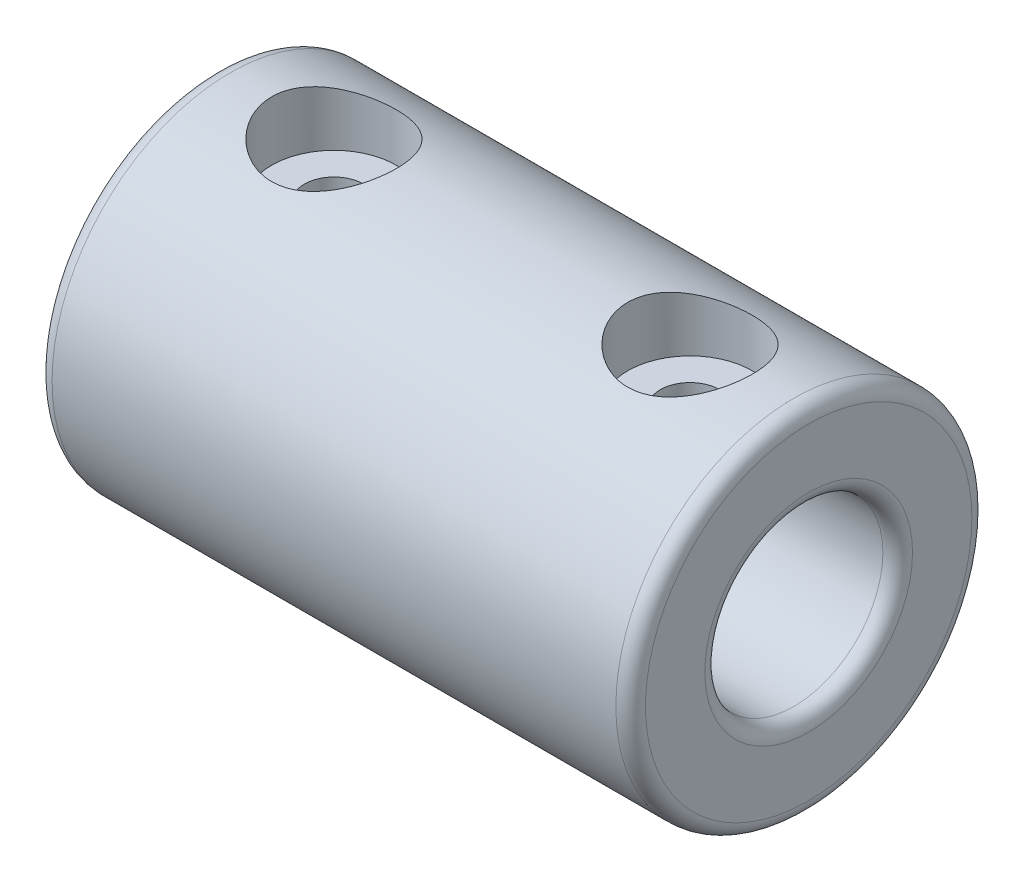
ISO-10303-21;
HEADER;
FILE_DESCRIPTION(('STEP AP214'),'2;1');
FILE_NAME('part.step','',(''),(''),'','','');
FILE_SCHEMA(('AUTOMOTIVE_DESIGN { 1 0 10303 214 1 1 1 1 }'));
ENDSEC;
DATA;
#1=APPLICATION_CONTEXT('core data for automotive mechanical design processes');
#2=APPLICATION_PROTOCOL_DEFINITION('international standard','automotive_design',2000,#1);
#3=PRODUCT_CONTEXT('',#1,'mechanical');
#4=PRODUCT('Part','Part','',(#3));
#5=PRODUCT_RELATED_PRODUCT_CATEGORY('part','',(#4));
#6=PRODUCT_DEFINITION_FORMATION('','',#4);
#7=PRODUCT_DEFINITION_CONTEXT('part definition',#1,'design');
#8=PRODUCT_DEFINITION('design','',#6,#7);
#9=PRODUCT_DEFINITION_SHAPE('','',#8);
#10=(LENGTH_UNIT() NAMED_UNIT(*) SI_UNIT(.MILLI.,.METRE.));
#11=(NAMED_UNIT(*) PLANE_ANGLE_UNIT() SI_UNIT($,.RADIAN.));
#12=(NAMED_UNIT(*) SI_UNIT($,.STERADIAN.) SOLID_ANGLE_UNIT());
#13=UNCERTAINTY_MEASURE_WITH_UNIT(LENGTH_MEASURE(1.E-05),#10,'distance_accuracy_value','');
#14=(GEOMETRIC_REPRESENTATION_CONTEXT(3) GLOBAL_UNCERTAINTY_ASSIGNED_CONTEXT((#13)) GLOBAL_UNIT_ASSIGNED_CONTEXT((#10,
#11,#12)) REPRESENTATION_CONTEXT('',''));
#15=CARTESIAN_POINT('',(0.,0.,0.));
#16=DIRECTION('',(0.,0.,1.));
#17=DIRECTION('',(1.,0.,0.));
#18=AXIS2_PLACEMENT_3D('',#15,#16,#17);
#19=CARTESIAN_POINT('',(-6.,6.001,0.));
#20=DIRECTION('',(0.,-1.,0.));
#21=DIRECTION('',(0.,0.,-1.));
#22=AXIS2_PLACEMENT_3D('',#19,#20,#21);
#23=CYLINDRICAL_SURFACE('',#22,1.);
#24=CARTESIAN_POINT('',(-6.,1.73205080756888,-1.));
#25=CARTESIAN_POINT('',(-6.05210780819525,1.73205534728459,-0.999996363074531));
#26=CARTESIAN_POINT('',(-6.10428141152505,1.73443801187756,-0.995899970733216));
#27=CARTESIAN_POINT('',(-6.20702726467716,1.74362366452052,-0.979723209898053));
#28=CARTESIAN_POINT('',(-6.25759591504341,1.75043594055559,-0.967626064554179));
#29=CARTESIAN_POINT('',(-6.35545166434394,1.76749346605398,-0.936099948699812));
#30=CARTESIAN_POINT('',(-6.40275465247359,1.77772043473252,-0.916709952493731));
#31=CARTESIAN_POINT('',(-6.49342420199672,1.80042664816858,-0.871267525376372));
#32=CARTESIAN_POINT('',(-6.53679055026246,1.81290601476065,-0.845214734035773));
#33=CARTESIAN_POINT('',(-6.62230572855751,1.83996869057441,-0.784666540530879));
#34=CARTESIAN_POINT('',(-6.66405913567355,1.85464063637954,-0.74965203614377));
#35=CARTESIAN_POINT('',(-6.74140838840671,1.88371982785706,-0.673253807614468));
#36=CARTESIAN_POINT('',(-6.77700116258352,1.8981269383125,-0.631866925782293));
#37=CARTESIAN_POINT('',(-6.84336715114767,1.92621476952949,-0.540489563414546));
#38=CARTESIAN_POINT('',(-6.87365376785953,1.93978106418172,-0.490107189012575));
#39=CARTESIAN_POINT('',(-6.92514085324577,1.96350756099529,-0.384157026599504));
#40=CARTESIAN_POINT('',(-6.94634705613717,1.97366991183742,-0.328592538138155));
#41=CARTESIAN_POINT('',(-6.9775046613011,1.98880461244237,-0.218044943925977));
#42=CARTESIAN_POINT('',(-6.98814952635554,1.99409480220892,-0.163301790488817));
#43=CARTESIAN_POINT('',(-7.00016611867504,2.00007583846067,-0.0525706286978481));
#44=CARTESIAN_POINT('',(-7.00154345679571,2.0007694678459,0.00341660584373854));
#45=CARTESIAN_POINT('',(-6.99525332602965,1.9976298191645,0.10983252442375));
#46=CARTESIAN_POINT('',(-6.98836198447878,1.9941849589216,0.160321199176791));
#47=CARTESIAN_POINT('',(-6.96711915609535,1.98374245259747,0.259313771918322));
#48=CARTESIAN_POINT('',(-6.95276711102378,1.97674454066394,0.307817521093925));
#49=CARTESIAN_POINT('',(-6.91691743391019,1.95971583287654,0.402309391569553));
#50=CARTESIAN_POINT('',(-6.89532368682794,1.94964441529199,0.448253423515178));
#51=CARTESIAN_POINT('',(-6.84573658379851,1.92737645986687,0.535976801513328));
#52=CARTESIAN_POINT('',(-6.81774093669765,1.91517916157484,0.577754648838646));
#53=CARTESIAN_POINT('',(-6.75310464846699,1.88844394399229,0.660173660898195));
#54=CARTESIAN_POINT('',(-6.71589697167399,1.87379375998175,0.70033407502936));
#55=CARTESIAN_POINT('',(-6.63541027506983,1.84454340586812,0.77410437029778));
#56=CARTESIAN_POINT('',(-6.59212662772594,1.82994328265629,0.807709211574231));
#57=CARTESIAN_POINT('',(-6.49735180757592,1.80144156092485,0.869505334642211));
#58=CARTESIAN_POINT('',(-6.44551397694579,1.78764319990708,0.897217314978051));
#59=CARTESIAN_POINT('',(-6.33706232864101,1.76375450278576,0.943319113001231));
#60=CARTESIAN_POINT('',(-6.28045356698244,1.75366030046067,0.96171865821089));
#61=CARTESIAN_POINT('',(-6.16878548871721,1.73944635817034,0.98718021102504));
#62=CARTESIAN_POINT('',(-6.11395888095645,1.73491655848496,0.995025122119975));
#63=CARTESIAN_POINT('',(-6.00359865848346,1.7311791936161,1.00151694661143));
#64=CARTESIAN_POINT('',(-5.94806557088022,1.73196786889312,1.00017035731503));
#65=CARTESIAN_POINT('',(-5.84434608142128,1.73834336540585,0.989036043343966));
#66=CARTESIAN_POINT('',(-5.79602054889208,1.74339587506654,0.980187816712467));
#67=CARTESIAN_POINT('',(-5.70163221372905,1.75694021551341,0.955696284632441));
#68=CARTESIAN_POINT('',(-5.6555701492534,1.76543316005034,0.940050778623614));
#69=CARTESIAN_POINT('',(-5.56458866909731,1.78536222079657,0.901647588604886));
#70=CARTESIAN_POINT('',(-5.51982098314645,1.79691643243063,0.878594063692723));
#71=CARTESIAN_POINT('',(-5.43453072846101,1.8215611949725,0.826287064015804));
#72=CARTESIAN_POINT('',(-5.39401035648672,1.83465253355148,0.797030404332216));
#73=CARTESIAN_POINT('',(-5.31302123247646,1.86287998456336,0.728837167198853));
#74=CARTESIAN_POINT('',(-5.27320284928234,1.87806583154289,0.689145272314966));
#75=CARTESIAN_POINT('',(-5.20058776200641,1.90734234977892,0.603404495398289));
#76=CARTESIAN_POINT('',(-5.16779342976946,1.92143265007709,0.557353474655347));
#77=CARTESIAN_POINT('',(-5.1094262740499,1.94741361690957,0.458535362558757));
#78=CARTESIAN_POINT('',(-5.08406688178909,1.95923641672029,0.405623097574113));
#79=CARTESIAN_POINT('',(-5.04286209614261,1.97883354959301,0.295522364641082));
#80=CARTESIAN_POINT('',(-5.0270083486337,1.98661143676373,0.238337701392176));
#81=CARTESIAN_POINT('',(-5.00663143582534,1.99667508181883,0.126979682330417));
#82=CARTESIAN_POINT('',(-5.00120212412389,1.99939927908191,0.0730114438504571));
#83=CARTESIAN_POINT('',(-4.9991567345456,2.00042130375131,-0.0351259859512033));
#84=CARTESIAN_POINT('',(-5.00253757147644,1.9987206806689,-0.0892951002950865));
#85=CARTESIAN_POINT('',(-5.01741640679563,1.99133968837923,-0.192537992317147));
#86=CARTESIAN_POINT('',(-5.02836484925767,1.9859289466799,-0.241712317811264));
#87=CARTESIAN_POINT('',(-5.05732699930298,1.97192093663423,-0.337445952183617));
#88=CARTESIAN_POINT('',(-5.07534172009346,1.96332321132796,-0.384004884955508));
#89=CARTESIAN_POINT('',(-5.11872705216598,1.9432593074812,-0.475423406244884));
#90=CARTESIAN_POINT('',(-5.14437932320784,1.93168617198799,-0.520125142700046));
#91=CARTESIAN_POINT('',(-5.20195793085905,1.90688133141826,-0.604774641814024));
#92=CARTESIAN_POINT('',(-5.23388714911568,1.89364886558361,-0.644720207414907));
#93=CARTESIAN_POINT('',(-5.30679713902271,1.86528610226628,-0.722914004156891));
#94=CARTESIAN_POINT('',(-5.3483624874772,1.85009799011698,-0.760597684539271));
#95=CARTESIAN_POINT('',(-5.43745072112977,1.82063076162852,-0.828663287394675));
#96=CARTESIAN_POINT('',(-5.48497882086769,1.80635245761865,-0.859038750010058));
#97=CARTESIAN_POINT('',(-5.58663664658096,1.77999605304916,-0.912431079785654));
#98=CARTESIAN_POINT('',(-5.64092753112874,1.7680017425627,-0.935185065960939));
#99=CARTESIAN_POINT('',(-5.75333240433978,1.74866156328352,-0.970878709506412));
#100=CARTESIAN_POINT('',(-5.81143288891269,1.74130016147702,-0.983851191175346));
#101=CARTESIAN_POINT('',(-5.891805355652,1.73529272601791,-0.994367007864414));
#102=CARTESIAN_POINT('',(-5.91336789439789,1.73408129005152,-0.996476104963851));
#103=CARTESIAN_POINT('',(-5.95661648068225,1.7324593588775,-0.999293405089963));
#104=CARTESIAN_POINT('',(-5.97830253638588,1.73204891725109,-1.00000151439987));
#105=CARTESIAN_POINT('',(-6.,1.73205080756888,-1.));
#106=B_SPLINE_CURVE_WITH_KNOTS('',3,(#24,#25,#26,#27,#28,#29,#30,#31,#32,#33,#34,#35,#36,#37,
#38,#39,#40,#41,#42,#43,#44,#45,#46,#47,#48,#49,#50,#51,#52,#53,#54,#55,#56,#57,#58,#59,#60,#61,
#62,#63,#64,#65,#66,#67,#68,#69,#70,#71,#72,#73,#74,#75,#76,#77,#78,#79,#80,#81,#82,#83,#84,#85,
#86,#87,#88,#89,#90,#91,#92,#93,#94,#95,#96,#97,#98,#99,#100,#101,#102,#103,#104,#105),
.UNSPECIFIED.,.T.,.F.,(4,2,2,2,2,2,2,2,2,2,2,2,2,2,2,2,2,2,2,2,2,2,2,2,2,2,2,2,2,2,2,2,2,2,2,2,
2,2,2,2,4),(0.,0.156232122594716,0.312792892824805,0.468528595918885,0.624272725445149,
0.792862312498234,0.961535710843709,1.14157892238763,1.32150826963891,1.48863484967935,
1.6556602368604,1.80816097484538,1.96067312517455,2.11529534731147,2.26997299350272,
2.43927191456891,2.60870048245918,2.78888841729448,2.96888774211705,3.13462290854212,
3.30024093188373,3.44774183424025,3.59529052436063,3.74967296406088,3.90413486220047,
4.07806743580613,4.25205864978202,4.43064181412966,4.60906779808772,4.77112270389487,
4.93312086793971,5.08444424871492,5.23578933512013,5.39360750719472,5.55149830100719,
5.72510241850067,5.89885942845154,6.07810749038605,6.2567513300276,6.32180135185309,
6.3868557249454),.UNSPECIFIED.);
#107=CARTESIAN_POINT('',(-6.,1.73205080756888,-1.));
#108=VERTEX_POINT('',#107);
#109=EDGE_CURVE('E84',#108,#108,#106,.T.);
#110=ORIENTED_EDGE('',*,*,#109,.F.);
#111=EDGE_LOOP('',(#110));
#112=FACE_BOUND('',#111,.T.);
#113=CARTESIAN_POINT('',(-6.,4.,0.));
#114=DIRECTION('',(0.,1.,0.));
#115=DIRECTION('',(0.,0.,1.));
#116=AXIS2_PLACEMENT_3D('',#113,#114,#115);
#117=CIRCLE('',#116,1.);
#118=CARTESIAN_POINT('',(-6.,4.,1.));
#119=VERTEX_POINT('',#118);
#120=EDGE_CURVE('E67',#119,#119,#117,.T.);
#121=ORIENTED_EDGE('',*,*,#120,.T.);
#122=EDGE_LOOP('',(#121));
#123=FACE_BOUND('',#122,.T.);
#124=ADVANCED_FACE('F37',(#112,#123),#23,.F.);
#125=CARTESIAN_POINT('',(6.,6.001,0.));
#126=DIRECTION('',(0.,-1.,0.));
#127=DIRECTION('',(0.,0.,-1.));
#128=AXIS2_PLACEMENT_3D('',#125,#126,#127);
#129=CYLINDRICAL_SURFACE('',#128,0.999999999999998);
#130=CARTESIAN_POINT('',(6.,2.82842712474619,-0.999999999999998));
#131=CARTESIAN_POINT('',(5.94553182518932,2.82842694532735,-1.0000002579478));
#132=CARTESIAN_POINT('',(5.89106520022847,2.83001769372806,-0.995534783698138));
#133=CARTESIAN_POINT('',(5.78374557904938,2.8361757417458,-0.977851131702562));
#134=CARTESIAN_POINT('',(5.73089285013606,2.8407435316722,-0.964631512170671));
#135=CARTESIAN_POINT('',(5.62837310698719,2.85228203663888,-0.92995548568026));
#136=CARTESIAN_POINT('',(5.57870007055312,2.8592480396464,-0.908515221401998));
#137=CARTESIAN_POINT('',(5.4836399514562,2.87479122017008,-0.858061628442625));
#138=CARTESIAN_POINT('',(5.4382538174475,2.88336875305432,-0.82904662886052));
#139=CARTESIAN_POINT('',(5.35128003766051,2.90154489405589,-0.763051146442524));
#140=CARTESIAN_POINT('',(5.30988457132796,2.91116894844139,-0.725824341377822));
#141=CARTESIAN_POINT('',(5.23379319877568,2.93013864801509,-0.644987667214487));
#142=CARTESIAN_POINT('',(5.19909836841772,2.93948424829099,-0.601376775052399));
#143=CARTESIAN_POINT('',(5.13652110267032,2.95713866921658,-0.507604507964982));
#144=CARTESIAN_POINT('',(5.10884002938202,2.96541407701568,-0.457301911224517));
#145=CARTESIAN_POINT('',(5.06240841487251,2.97969586771021,-0.35243122298748));
#146=CARTESIAN_POINT('',(5.0436554668231,2.98570286203012,-0.297864285687213));
#147=CARTESIAN_POINT('',(5.0162641453676,2.99459075431897,-0.188028817433492));
#148=CARTESIAN_POINT('',(5.00729655374299,2.99757314777558,-0.132850754852967));
#149=CARTESIAN_POINT('',(4.99868370663934,3.00043608218249,-0.0216978748240903));
#150=CARTESIAN_POINT('',(4.99903604834758,3.00031742262891,0.0342767335438936));
#151=CARTESIAN_POINT('',(5.00884425456603,2.99706039618736,0.143103515193818));
#152=CARTESIAN_POINT('',(5.01794252847451,2.99404064755135,0.195992048591668));
#153=CARTESIAN_POINT('',(5.04439298098046,2.98546967339714,0.299443438822161));
#154=CARTESIAN_POINT('',(5.06174571897976,2.97991827631115,0.350006137779175));
#155=CARTESIAN_POINT('',(5.10442131730613,2.96675670293292,0.448152474842013));
#156=CARTESIAN_POINT('',(5.12984593854678,2.9591204252427,0.495688220968998));
#157=CARTESIAN_POINT('',(5.18785970544839,2.94258393038665,0.585924325527169));
#158=CARTESIAN_POINT('',(5.22045084332664,2.93368336200518,0.628623334384769));
#159=CARTESIAN_POINT('',(5.29367439346074,2.9150619185089,0.710100866551906));
#160=CARTESIAN_POINT('',(5.33461315784544,2.90532215172667,0.748600157067555));
#161=CARTESIAN_POINT('',(5.42244872572266,2.88647335245111,0.818277259595888));
#162=CARTESIAN_POINT('',(5.46934644571324,2.8773644173145,0.849453943273004));
#163=CARTESIAN_POINT('',(5.56865362561542,2.86070525135531,0.903987455042731));
#164=CARTESIAN_POINT('',(5.62113213136781,2.85317909338821,0.927226463651048));
#165=CARTESIAN_POINT('',(5.72957139426626,2.84081650878299,0.964443193299505));
#166=CARTESIAN_POINT('',(5.78553068122183,2.83597895501223,0.978424795755528));
#167=CARTESIAN_POINT('',(5.89663835540062,2.8297963630207,0.996161282090472));
#168=CARTESIAN_POINT('',(5.95170942474572,2.82830360315139,1.00034909550575));
#169=CARTESIAN_POINT('',(6.06177614911704,2.82856672062801,0.999605438911603));
#170=CARTESIAN_POINT('',(6.11677181602476,2.83032200792768,0.994675625227258));
#171=CARTESIAN_POINT('',(6.22315696571116,2.83673618089379,0.976225651551828));
#172=CARTESIAN_POINT('',(6.27460543015064,2.84129325440593,0.963006393980553));
#173=CARTESIAN_POINT('',(6.37454360623938,2.8526855367127,0.928713862560594));
#174=CARTESIAN_POINT('',(6.42303279159083,2.85952114934907,0.907639196363455));
#175=CARTESIAN_POINT('',(6.51738042084694,2.87496877595718,0.857474340738898));
#176=CARTESIAN_POINT('',(6.56310664264179,2.8836302566561,0.828151118358485));
#177=CARTESIAN_POINT('',(6.64914605238373,2.90165768730984,0.762585630557566));
#178=CARTESIAN_POINT('',(6.68945763866122,2.911023844438,0.726341325498782));
#179=CARTESIAN_POINT('',(6.76552798409063,2.92995038637844,0.64589170590032));
#180=CARTESIAN_POINT('',(6.80097439001885,2.93949843577895,0.601387270546649));
#181=CARTESIAN_POINT('',(6.86391614234804,2.9572685161311,0.506827291400255));
#182=CARTESIAN_POINT('',(6.89141177116242,2.96549059417695,0.45677194486455));
#183=CARTESIAN_POINT('',(6.93742010486171,2.97964405810603,0.352779862432293));
#184=CARTESIAN_POINT('',(6.95599127714806,2.98559030004531,0.298871123321195));
#185=CARTESIAN_POINT('',(6.9837277420601,2.99458610837774,0.188458465846015));
#186=CARTESIAN_POINT('',(6.9928964298805,2.99763672034018,0.131955491953888));
#187=CARTESIAN_POINT('',(7.00126207760564,3.00041863236257,0.0208153358600398));
#188=CARTESIAN_POINT('',(7.00090745393237,3.00029920089441,-0.0337847239200196));
#189=CARTESIAN_POINT('',(6.99134269185359,2.99712196519396,-0.142111145000174));
#190=CARTESIAN_POINT('',(6.98213327184723,2.99406439933567,-0.195837576819056));
#191=CARTESIAN_POINT('',(6.95541776542403,2.98540914954421,-0.300042119432061));
#192=CARTESIAN_POINT('',(6.93804578464705,2.9798525836118,-0.350558270912795));
#193=CARTESIAN_POINT('',(6.89562246890286,2.96677160704464,-0.447978350939789));
#194=CARTESIAN_POINT('',(6.87056974480306,2.95924684047901,-0.494881624142409));
#195=CARTESIAN_POINT('',(6.81243048789792,2.94265868828001,-0.585634016308808));
#196=CARTESIAN_POINT('',(6.77908131461808,2.93354872492381,-0.629306251557695));
#197=CARTESIAN_POINT('',(6.70574260884408,2.91492988791425,-0.710581026272337));
#198=CARTESIAN_POINT('',(6.66575095773832,2.90542088771397,-0.748181621624258));
#199=CARTESIAN_POINT('',(6.57839064441196,2.88663279827365,-0.817741808833463));
#200=CARTESIAN_POINT('',(6.53079448901923,2.87737727995345,-0.849422965999215));
#201=CARTESIAN_POINT('',(6.43066557310135,2.86060193316303,-0.904314343299798));
#202=CARTESIAN_POINT('',(6.37813410698575,2.8530816513617,-0.927526776814557));
#203=CARTESIAN_POINT('',(6.27203817597616,2.84101334230535,-0.963843828206625));
#204=CARTESIAN_POINT('',(6.21862773643428,2.836346329448,-0.977357909163266));
#205=CARTESIAN_POINT('',(6.11014394948452,2.8300538361394,-0.995434320161692));
#206=CARTESIAN_POINT('',(6.05507118256425,2.82842730615135,-0.999999739196499));
#207=CARTESIAN_POINT('',(6.,2.82842712474619,-0.999999999999998));
#208=B_SPLINE_CURVE_WITH_KNOTS('',3,(#130,#131,#132,#133,#134,#135,#136,#137,#138,#139,#140,
#141,#142,#143,#144,#145,#146,#147,#148,#149,#150,#151,#152,#153,#154,#155,#156,#157,#158,#159,
#160,#161,#162,#163,#164,#165,#166,#167,#168,#169,#170,#171,#172,#173,#174,#175,#176,#177,#178,
#179,#180,#181,#182,#183,#184,#185,#186,#187,#188,#189,#190,#191,#192,#193,#194,#195,#196,#197,
#198,#199,#200,#201,#202,#203,#204,#205,#206,#207),.UNSPECIFIED.,.T.,.F.,(4,2,2,2,2,2,2,2,2,2,2,
2,2,2,2,2,2,2,2,2,2,2,2,2,2,2,2,2,2,2,2,2,2,2,2,2,2,2,4),(0.,0.163200584775417,0.32642805496888,
0.489336627454544,0.652281166139158,0.821013374229397,0.989772651673595,1.16293506139029,
1.3360507638216,1.50314318760306,1.67019253297699,1.8306900482094,1.99119844184608,
2.15381654855706,2.31647991869393,2.48680174359289,2.65714979607477,2.82992639837376,
3.00263051349688,3.16754291357512,3.33242535830306,3.49164395761848,3.65089079140018,
3.81518857728787,3.97953485655199,4.15178808164165,4.32403518750604,4.49513791183924,
4.66617882997229,4.82918084670707,4.99216964002853,5.15256956033502,5.31299850756314,
5.47935519513705,5.64576504425703,5.81868902729216,5.99156778259938,6.15663212153685,
6.32163947179228),.UNSPECIFIED.);
#209=CARTESIAN_POINT('',(6.,2.82842712474619,-0.999999999999998));
#210=VERTEX_POINT('',#209);
#211=EDGE_CURVE('E93',#210,#210,#208,.T.);
#212=ORIENTED_EDGE('',*,*,#211,.F.);
#213=EDGE_LOOP('',(#212));
#214=FACE_BOUND('',#213,.T.);
#215=CARTESIAN_POINT('',(6.,4.,0.));
#216=DIRECTION('',(0.,1.,0.));
#217=DIRECTION('',(0.,0.,1.));
#218=AXIS2_PLACEMENT_3D('',#215,#216,#217);
#219=CIRCLE('',#218,0.999999999999998);
#220=CARTESIAN_POINT('',(6.,4.,0.999999999999998));
#221=VERTEX_POINT('',#220);
#222=EDGE_CURVE('E143',#221,#221,#219,.T.);
#223=ORIENTED_EDGE('',*,*,#222,.T.);
#224=EDGE_LOOP('',(#223));
#225=FACE_BOUND('',#224,.T.);
#226=ADVANCED_FACE('F104',(#214,#225),#129,.F.);
#227=CARTESIAN_POINT('',(-10.,0.,0.));
#228=DIRECTION('',(1.,0.,0.));
#229=DIRECTION('',(0.,0.,-1.));
#230=AXIS2_PLACEMENT_3D('',#227,#228,#229);
#231=CYLINDRICAL_SURFACE('',#230,6.);
#232=CARTESIAN_POINT('',(-6.,5.62049819855856,2.1));
#233=CARTESIAN_POINT('',(-5.8859908629341,5.62049664583151,2.10000183392047));
#234=CARTESIAN_POINT('',(-5.77199450023092,5.62400496831304,2.0906844341507));
#235=CARTESIAN_POINT('',(-5.54740246387318,5.63757664755876,2.0538034121171));
#236=CARTESIAN_POINT('',(-5.4368070735741,5.64764054896648,2.02623827381128));
#237=CARTESIAN_POINT('',(-5.22231198983434,5.67304678569866,1.95396754262052));
#238=CARTESIAN_POINT('',(-5.11839861341697,5.6883778981936,1.90929837025929));
#239=CARTESIAN_POINT('',(-4.91950393955718,5.72257413857459,1.80421393109003));
#240=CARTESIAN_POINT('',(-4.82452492145415,5.74144016463705,1.74379466085327));
#241=CARTESIAN_POINT('',(-4.64209282993042,5.78149405495312,1.60612976379037));
#242=CARTESIAN_POINT('',(-4.55508129369763,5.80274397711165,1.52831692511239));
#243=CARTESIAN_POINT('',(-4.39503750358003,5.84464952300565,1.35928149750693));
#244=CARTESIAN_POINT('',(-4.32200776337503,5.86530503931134,1.26805650251293));
#245=CARTESIAN_POINT('',(-4.18994992264804,5.90442033428759,1.07151011163135));
#246=CARTESIAN_POINT('',(-4.13139114595428,5.92279871940295,0.965855744444189));
#247=CARTESIAN_POINT('',(-4.03305622935087,5.95455216146555,0.7454408605281));
#248=CARTESIAN_POINT('',(-3.99327447215527,5.96792871449917,0.630683079168861));
#249=CARTESIAN_POINT('',(-3.93513985351415,5.987731406374,0.399953329353737));
#250=CARTESIAN_POINT('',(-3.91602915296876,5.99440266306354,0.284193742860488));
#251=CARTESIAN_POINT('',(-3.89736229480846,6.00091688970397,0.0509313612862933));
#252=CARTESIAN_POINT('',(-3.89780059106696,6.00076179631715,-0.0665709299255994));
#253=CARTESIAN_POINT('',(-3.91775376980731,5.99380298814009,-0.294593124821953));
#254=CARTESIAN_POINT('',(-3.93644401820294,5.98728668132325,-0.405195428634549));
#255=CARTESIAN_POINT('',(-3.99099781675359,5.9687047041447,-0.621581077155496));
#256=CARTESIAN_POINT('',(-4.02686255706658,5.95663864919881,-0.727364087339984));
#257=CARTESIAN_POINT('',(-4.11518958192664,5.92796321816309,-0.932828899090625));
#258=CARTESIAN_POINT('',(-4.16787375120113,5.91129353147342,-1.032406550088));
#259=CARTESIAN_POINT('',(-4.28815647199501,5.87512754462533,-1.22154070440799));
#260=CARTESIAN_POINT('',(-4.35575945350491,5.85563040547432,-1.31109421923475));
#261=CARTESIAN_POINT('',(-4.50804728813643,5.81466073961639,-1.48252795143937));
#262=CARTESIAN_POINT('',(-4.59343322101614,5.79313819397397,-1.56377436704445));
#263=CARTESIAN_POINT('',(-4.77678239026933,5.7513741792681,-1.71101327031471));
#264=CARTESIAN_POINT('',(-4.87474799556687,5.7311329525691,-1.77700287834318));
#265=CARTESIAN_POINT('',(-5.08267204143827,5.69393293954876,-1.89285691923176));
#266=CARTESIAN_POINT('',(-5.19280717368503,5.67703632147326,-1.94242576165358));
#267=CARTESIAN_POINT('',(-5.42060480898083,5.64915572593063,-2.02208854460283));
#268=CARTESIAN_POINT('',(-5.5382637360735,5.63816896261968,-2.05219166242463));
#269=CARTESIAN_POINT('',(-5.7715780497682,5.62399263581828,-2.09071998372688));
#270=CARTESIAN_POINT('',(-5.88704783857021,5.62044649299884,-2.10013762361127));
#271=CARTESIAN_POINT('',(-6.11794749629983,5.62055101387308,-2.0998594060516));
#272=CARTESIAN_POINT('',(-6.23337736854775,5.62420019227553,-2.09016749328916));
#273=CARTESIAN_POINT('',(-6.45619087101844,5.63792601318416,-2.05284050372258));
#274=CARTESIAN_POINT('',(-6.56371252015608,5.64774496069313,-2.02592405668403));
#275=CARTESIAN_POINT('',(-6.77268184137405,5.67241183587193,-1.95579041232059));
#276=CARTESIAN_POINT('',(-6.87412836504529,5.68726071086302,-1.91257014420932));
#277=CARTESIAN_POINT('',(-7.07190566650239,5.72093971005748,-1.80938709290032));
#278=CARTESIAN_POINT('',(-7.16794411702222,5.73988830803675,-1.74890374170465));
#279=CARTESIAN_POINT('',(-7.34886506913832,5.77941412178293,-1.61348700379828));
#280=CARTESIAN_POINT('',(-7.43374394899802,5.79999186281896,-1.53854894531554));
#281=CARTESIAN_POINT('',(-7.59467237125452,5.84179871415577,-1.37155948469132));
#282=CARTESIAN_POINT('',(-7.66999931558662,5.86300314137944,-1.27880333095808));
#283=CARTESIAN_POINT('',(-7.80408108159508,5.90259223696936,-1.08144356167349));
#284=CARTESIAN_POINT('',(-7.86283628828729,5.92097697084181,-0.976840221450328));
#285=CARTESIAN_POINT('',(-7.96161255653306,5.95279281741868,-0.759129698059029));
#286=CARTESIAN_POINT('',(-8.00173782619563,5.96625139312545,-0.646074027219717));
#287=CARTESIAN_POINT('',(-8.06221534858065,5.9868116209636,-0.414248850041631));
#288=CARTESIAN_POINT('',(-8.08257555940527,5.99391583149341,-0.295481663590945));
#289=CARTESIAN_POINT('',(-8.10217224756214,6.00075437840247,-0.0621821302514157));
#290=CARTESIAN_POINT('',(-8.10244147708331,6.00084903050369,0.0522537808564038));
#291=CARTESIAN_POINT('',(-8.08443834225149,5.99456520252123,0.279465044357217));
#292=CARTESIAN_POINT('',(-8.06616775041486,5.98818734124803,0.392240554448666));
#293=CARTESIAN_POINT('',(-8.01230718488033,5.96982073900785,0.610778183645899));
#294=CARTESIAN_POINT('',(-7.97705281210022,5.95794088668529,0.716632835676152));
#295=CARTESIAN_POINT('',(-7.89054437409333,5.92979682904224,0.920954416283842));
#296=CARTESIAN_POINT('',(-7.83928733432668,5.9135318086933,1.01941996716771));
#297=CARTESIAN_POINT('',(-7.71992737022291,5.87748193017464,1.21038035179718));
#298=CARTESIAN_POINT('',(-7.65124327140597,5.85758416144814,1.30249027603846));
#299=CARTESIAN_POINT('',(-7.49993840062416,5.81674433892569,1.47420813664784));
#300=CARTESIAN_POINT('',(-7.41731295830423,5.7958019368387,1.55381186612156));
#301=CARTESIAN_POINT('',(-7.23609774587122,5.75411472954402,1.70186578231573));
#302=CARTESIAN_POINT('',(-7.13696240034785,5.73341989776723,1.76966457617208));
#303=CARTESIAN_POINT('',(-6.92805137141015,5.6956781363437,1.8876183119895));
#304=CARTESIAN_POINT('',(-6.8182770674183,5.67863073469664,1.93777553742171));
#305=CARTESIAN_POINT('',(-6.59231742183715,5.65052522432761,2.01826100468311));
#306=CARTESIAN_POINT('',(-6.47621662407044,5.63940282619449,2.0488028637206));
#307=CARTESIAN_POINT('',(-6.24007130080431,5.62439175486355,2.08966685598283));
#308=CARTESIAN_POINT('',(-6.12002857095733,5.62049983326621,2.09999806925253));
#309=CARTESIAN_POINT('',(-6.,5.62049819855856,2.1));
#310=B_SPLINE_CURVE_WITH_KNOTS('',3,(#232,#233,#234,#235,#236,#237,#238,#239,#240,#241,#242,
#243,#244,#245,#246,#247,#248,#249,#250,#251,#252,#253,#254,#255,#256,#257,#258,#259,#260,#261,
#262,#263,#264,#265,#266,#267,#268,#269,#270,#271,#272,#273,#274,#275,#276,#277,#278,#279,#280,
#281,#282,#283,#284,#285,#286,#287,#288,#289,#290,#291,#292,#293,#294,#295,#296,#297,#298,#299,
#300,#301,#302,#303,#304,#305,#306,#307,#308,#309),.UNSPECIFIED.,.T.,.F.,(4,2,2,2,2,2,2,2,2,2,2,
2,2,2,2,2,2,2,2,2,2,2,2,2,2,2,2,2,2,2,2,2,2,2,2,2,2,2,4),(0.,0.341581962713037,
0.683192307989644,1.02407925348462,1.36505293174606,1.71940579240763,2.07382229975039,
2.43855298376332,2.8031744865972,3.1539208385341,3.50456768299671,3.84007194782351,
4.17559946579064,4.5157501416598,4.85600195806708,5.21379905942501,5.57166363794495,
5.93565848344084,6.29948159486757,6.64542887028432,6.99130474115211,7.32361553252677,
7.65598894513422,7.99969400689684,8.34351034108727,8.70586039893282,9.06820203750374,
9.42849171734224,9.78863627174606,10.1302545747611,10.471840220127,10.806936933281,
11.1420959705822,11.4903822545166,11.8387854469785,12.2026433598833,12.5664541587759,
12.926232579405,13.2858493250834),.UNSPECIFIED.);
#311=CARTESIAN_POINT('',(-6.,5.62049819855856,2.1));
#312=VERTEX_POINT('',#311);
#313=EDGE_CURVE('E10',#312,#312,#310,.T.);
#314=ORIENTED_EDGE('',*,*,#313,.F.);
#315=EDGE_LOOP('',(#314));
#316=FACE_BOUND('',#315,.T.);
#317=CARTESIAN_POINT('',(6.,5.62049819855856,2.1));
#318=CARTESIAN_POINT('',(6.1140091370659,5.62049664583151,2.10000183392047));
#319=CARTESIAN_POINT('',(6.22800549976908,5.62400496831304,2.0906844341507));
#320=CARTESIAN_POINT('',(6.45259753612682,5.63757664755876,2.0538034121171));
#321=CARTESIAN_POINT('',(6.5631929264259,5.64764054896648,2.02623827381128));
#322=CARTESIAN_POINT('',(6.77768801016566,5.67304678569866,1.95396754262052));
#323=CARTESIAN_POINT('',(6.88160138658303,5.6883778981936,1.90929837025929));
#324=CARTESIAN_POINT('',(7.08049606044283,5.72257413857459,1.80421393109003));
#325=CARTESIAN_POINT('',(7.17547507854585,5.74144016463705,1.74379466085327));
#326=CARTESIAN_POINT('',(7.35790717006958,5.78149405495312,1.60612976379037));
#327=CARTESIAN_POINT('',(7.44491870630238,5.80274397711166,1.52831692511239));
#328=CARTESIAN_POINT('',(7.60496249641997,5.84464952300565,1.35928149750692));
#329=CARTESIAN_POINT('',(7.67799223662497,5.86530503931134,1.26805650251292));
#330=CARTESIAN_POINT('',(7.81005007735196,5.90442033428759,1.07151011163135));
#331=CARTESIAN_POINT('',(7.86860885404573,5.92279871940295,0.965855744444188));
#332=CARTESIAN_POINT('',(7.96694377064914,5.95455216146555,0.7454408605281));
#333=CARTESIAN_POINT('',(8.00672552784473,5.96792871449917,0.63068307916886));
#334=CARTESIAN_POINT('',(8.06486014648585,5.987731406374,0.399953329353736));
#335=CARTESIAN_POINT('',(8.08397084703124,5.99440266306354,0.284193742860487));
#336=CARTESIAN_POINT('',(8.10263770519154,6.00091688970397,0.0509313612862924));
#337=CARTESIAN_POINT('',(8.10219940893304,6.00076179631714,-0.0665709299256003));
#338=CARTESIAN_POINT('',(8.08224623019269,5.99380298814009,-0.294593124821954));
#339=CARTESIAN_POINT('',(8.06355598179707,5.98728668132325,-0.405195428634551));
#340=CARTESIAN_POINT('',(8.00900218324642,5.9687047041447,-0.621581077155497));
#341=CARTESIAN_POINT('',(7.97313744293342,5.95663864919881,-0.727364087339985));
#342=CARTESIAN_POINT('',(7.88481041807335,5.92796321816309,-0.932828899090626));
#343=CARTESIAN_POINT('',(7.83212624879887,5.91129353147342,-1.032406550088));
#344=CARTESIAN_POINT('',(7.71184352800499,5.87512754462533,-1.22154070440799));
#345=CARTESIAN_POINT('',(7.64424054649509,5.85563040547432,-1.31109421923475));
#346=CARTESIAN_POINT('',(7.49195271186357,5.81466073961639,-1.48252795143937));
#347=CARTESIAN_POINT('',(7.40656677898386,5.79313819397397,-1.56377436704445));
#348=CARTESIAN_POINT('',(7.22321760973067,5.7513741792681,-1.71101327031471));
#349=CARTESIAN_POINT('',(7.12525200443313,5.7311329525691,-1.77700287834318));
#350=CARTESIAN_POINT('',(6.91732795856173,5.69393293954876,-1.89285691923176));
#351=CARTESIAN_POINT('',(6.80719282631497,5.67703632147326,-1.94242576165358));
#352=CARTESIAN_POINT('',(6.57939519101917,5.64915572593063,-2.02208854460283));
#353=CARTESIAN_POINT('',(6.46173626392651,5.63816896261968,-2.05219166242463));
#354=CARTESIAN_POINT('',(6.2284219502318,5.62399263581828,-2.09071998372688));
#355=CARTESIAN_POINT('',(6.11295216142979,5.62044649299884,-2.10013762361127));
#356=CARTESIAN_POINT('',(5.88205250370018,5.62055101387308,-2.0998594060516));
#357=CARTESIAN_POINT('',(5.76662263145225,5.62420019227553,-2.09016749328915));
#358=CARTESIAN_POINT('',(5.54380912898156,5.63792601318417,-2.05284050372258));
#359=CARTESIAN_POINT('',(5.43628747984392,5.64774496069313,-2.02592405668403));
#360=CARTESIAN_POINT('',(5.22731815862595,5.67241183587193,-1.95579041232059));
#361=CARTESIAN_POINT('',(5.12587163495472,5.68726071086302,-1.91257014420932));
#362=CARTESIAN_POINT('',(4.92809433349761,5.72093971005748,-1.80938709290032));
#363=CARTESIAN_POINT('',(4.83205588297778,5.73988830803675,-1.74890374170465));
#364=CARTESIAN_POINT('',(4.65113493086169,5.77941412178293,-1.61348700379828));
#365=CARTESIAN_POINT('',(4.56625605100199,5.79999186281896,-1.53854894531554));
#366=CARTESIAN_POINT('',(4.40532762874548,5.84179871415577,-1.37155948469132));
#367=CARTESIAN_POINT('',(4.33000068441338,5.86300314137944,-1.27880333095808));
#368=CARTESIAN_POINT('',(4.19591891840492,5.90259223696936,-1.08144356167349));
#369=CARTESIAN_POINT('',(4.13716371171271,5.92097697084181,-0.976840221450326));
#370=CARTESIAN_POINT('',(4.03838744346695,5.95279281741868,-0.759129698059027));
#371=CARTESIAN_POINT('',(3.99826217380437,5.96625139312545,-0.646074027219715));
#372=CARTESIAN_POINT('',(3.93778465141935,5.9868116209636,-0.414248850041629));
#373=CARTESIAN_POINT('',(3.91742444059473,5.99391583149341,-0.295481663590943));
#374=CARTESIAN_POINT('',(3.89782775243786,6.00075437840247,-0.0621821302514141));
#375=CARTESIAN_POINT('',(3.8975585229167,6.00084903050369,0.0522537808564059));
#376=CARTESIAN_POINT('',(3.91556165774851,5.99456520252123,0.27946504435722));
#377=CARTESIAN_POINT('',(3.93383224958515,5.98818734124803,0.392240554448668));
#378=CARTESIAN_POINT('',(3.98769281511967,5.96982073900785,0.610778183645899));
#379=CARTESIAN_POINT('',(4.02294718789979,5.95794088668529,0.716632835676152));
#380=CARTESIAN_POINT('',(4.10945562590668,5.92979682904224,0.920954416283842));
#381=CARTESIAN_POINT('',(4.16071266567332,5.9135318086933,1.01941996716771));
#382=CARTESIAN_POINT('',(4.28007262977709,5.87748193017464,1.21038035179718));
#383=CARTESIAN_POINT('',(4.34875672859404,5.85758416144814,1.30249027603846));
#384=CARTESIAN_POINT('',(4.50006159937585,5.81674433892569,1.47420813664784));
#385=CARTESIAN_POINT('',(4.58268704169577,5.7958019368387,1.55381186612156));
#386=CARTESIAN_POINT('',(4.76390225412879,5.75411472954402,1.70186578231573));
#387=CARTESIAN_POINT('',(4.86303759965215,5.73341989776723,1.76966457617208));
#388=CARTESIAN_POINT('',(5.07194862858986,5.6956781363437,1.8876183119895));
#389=CARTESIAN_POINT('',(5.18172293258171,5.67863073469664,1.93777553742171));
#390=CARTESIAN_POINT('',(5.40768257816285,5.65052522432762,2.01826100468311));
#391=CARTESIAN_POINT('',(5.52378337592957,5.63940282619449,2.0488028637206));
#392=CARTESIAN_POINT('',(5.75992869919569,5.62439175486355,2.08966685598283));
#393=CARTESIAN_POINT('',(5.87997142904268,5.62049983326621,2.09999806925252));
#394=CARTESIAN_POINT('',(6.,5.62049819855856,2.1));
#395=B_SPLINE_CURVE_WITH_KNOTS('',3,(#317,#318,#319,#320,#321,#322,#323,#324,#325,#326,#327,
#328,#329,#330,#331,#332,#333,#334,#335,#336,#337,#338,#339,#340,#341,#342,#343,#344,#345,#346,
#347,#348,#349,#350,#351,#352,#353,#354,#355,#356,#357,#358,#359,#360,#361,#362,#363,#364,#365,
#366,#367,#368,#369,#370,#371,#372,#373,#374,#375,#376,#377,#378,#379,#380,#381,#382,#383,#384,
#385,#386,#387,#388,#389,#390,#391,#392,#393,#394),.UNSPECIFIED.,.T.,.F.,(4,2,2,2,2,2,2,2,2,2,2,
2,2,2,2,2,2,2,2,2,2,2,2,2,2,2,2,2,2,2,2,2,2,2,2,2,2,2,4),(0.,0.341581962713037,
0.683192307989644,1.02407925348462,1.36505293174606,1.71940579240763,2.07382229975039,
2.43855298376332,2.8031744865972,3.1539208385341,3.50456768299671,3.84007194782351,
4.17559946579064,4.5157501416598,4.85600195806708,5.21379905942501,5.57166363794494,
5.93565848344084,6.29948159486757,6.64542887028432,6.9913047411521,7.32361553252677,
7.65598894513422,7.99969400689684,8.34351034108727,8.70586039893281,9.06820203750374,
9.42849171734224,9.78863627174606,10.1302545747611,10.471840220127,10.806936933281,
11.1420959705822,11.4903822545166,11.8387854469785,12.2026433598833,12.5664541587759,
12.9262325794049,13.2858493250834),.UNSPECIFIED.);
#396=CARTESIAN_POINT('',(6.,5.62049819855856,2.1));
#397=VERTEX_POINT('',#396);
#398=EDGE_CURVE('E50',#397,#397,#395,.T.);
#399=ORIENTED_EDGE('',*,*,#398,.F.);
#400=EDGE_LOOP('',(#399));
#401=FACE_BOUND('',#400,.T.);
#402=CARTESIAN_POINT('',(9.5,0.,0.));
#403=DIRECTION('',(1.,0.,0.));
#404=DIRECTION('',(0.,0.,-1.));
#405=AXIS2_PLACEMENT_3D('',#402,#403,#404);
#406=CIRCLE('',#405,6.);
#407=CARTESIAN_POINT('',(9.5,0.,-6.));
#408=VERTEX_POINT('',#407);
#409=EDGE_CURVE('E158',#408,#408,#406,.F.);
#410=ORIENTED_EDGE('',*,*,#409,.T.);
#411=EDGE_LOOP('',(#410));
#412=FACE_BOUND('',#411,.T.);
#413=CARTESIAN_POINT('',(-9.5,0.,0.));
#414=DIRECTION('',(1.,0.,0.));
#415=DIRECTION('',(0.,0.,-1.));
#416=AXIS2_PLACEMENT_3D('',#413,#414,#415);
#417=CIRCLE('',#416,6.);
#418=CARTESIAN_POINT('',(-9.5,0.,-6.));
#419=VERTEX_POINT('',#418);
#420=EDGE_CURVE('E162',#419,#419,#417,.T.);
#421=ORIENTED_EDGE('',*,*,#420,.T.);
#422=EDGE_LOOP('',(#421));
#423=FACE_BOUND('',#422,.T.);
#424=ADVANCED_FACE('F69',(#316,#401,#412,#423),#231,.T.);
#425=CARTESIAN_POINT('',(0.,0.,0.));
#426=DIRECTION('',(1.,0.,0.));
#427=DIRECTION('',(0.,0.,-1.));
#428=AXIS2_PLACEMENT_3D('',#425,#426,#427);
#429=CYLINDRICAL_SURFACE('',#428,3.);
#430=CARTESIAN_POINT('',(9.5,0.,0.));
#431=DIRECTION('',(1.,0.,0.));
#432=DIRECTION('',(0.,0.,-1.));
#433=AXIS2_PLACEMENT_3D('',#430,#431,#432);
#434=CIRCLE('',#433,3.);
#435=CARTESIAN_POINT('',(9.5,0.,-3.));
#436=VERTEX_POINT('',#435);
#437=EDGE_CURVE('E174',#436,#436,#434,.T.);
#438=ORIENTED_EDGE('',*,*,#437,.T.);
#439=EDGE_LOOP('',(#438));
#440=FACE_BOUND('',#439,.T.);
#441=CARTESIAN_POINT('',(0.,0.,0.));
#442=DIRECTION('',(1.,0.,0.));
#443=DIRECTION('',(0.,0.,-1.));
#444=AXIS2_PLACEMENT_3D('',#441,#442,#443);
#445=CIRCLE('',#444,3.);
#446=CARTESIAN_POINT('',(0.,0.,-3.));
#447=VERTEX_POINT('',#446);
#448=EDGE_CURVE('E177',#447,#447,#445,.T.);
#449=ORIENTED_EDGE('',*,*,#448,.F.);
#450=EDGE_LOOP('',(#449));
#451=FACE_BOUND('',#450,.T.);
#452=ORIENTED_EDGE('',*,*,#211,.T.);
#453=EDGE_LOOP('',(#452));
#454=FACE_BOUND('',#453,.T.);
#455=ADVANCED_FACE('F114',(#440,#451,#454),#429,.F.);
#456=CARTESIAN_POINT('',(0.,0.,0.));
#457=DIRECTION('',(-1.,0.,0.));
#458=DIRECTION('',(0.,0.,1.));
#459=AXIS2_PLACEMENT_3D('',#456,#457,#458);
#460=CYLINDRICAL_SURFACE('',#459,2.);
#461=CARTESIAN_POINT('',(-9.5,0.,0.));
#462=DIRECTION('',(1.,0.,0.));
#463=DIRECTION('',(0.,0.,-1.));
#464=AXIS2_PLACEMENT_3D('',#461,#462,#463);
#465=CIRCLE('',#464,2.);
#466=CARTESIAN_POINT('',(-9.5,0.,-2.));
#467=VERTEX_POINT('',#466);
#468=EDGE_CURVE('E55',#467,#467,#465,.F.);
#469=ORIENTED_EDGE('',*,*,#468,.T.);
#470=EDGE_LOOP('',(#469));
#471=FACE_BOUND('',#470,.T.);
#472=CARTESIAN_POINT('',(0.,0.,0.));
#473=DIRECTION('',(-1.,0.,0.));
#474=DIRECTION('',(0.,0.,1.));
#475=AXIS2_PLACEMENT_3D('',#472,#473,#474);
#476=CIRCLE('',#475,2.);
#477=CARTESIAN_POINT('',(0.,0.,2.));
#478=VERTEX_POINT('',#477);
#479=EDGE_CURVE('E92',#478,#478,#476,.T.);
#480=ORIENTED_EDGE('',*,*,#479,.F.);
#481=EDGE_LOOP('',(#480));
#482=FACE_BOUND('',#481,.T.);
#483=ORIENTED_EDGE('',*,*,#109,.T.);
#484=EDGE_LOOP('',(#483));
#485=FACE_BOUND('',#484,.T.);
#486=ADVANCED_FACE('F110',(#471,#482,#485),#460,.F.);
#487=CARTESIAN_POINT('',(-10.,0.,0.));
#488=DIRECTION('',(1.,0.,0.));
#489=DIRECTION('',(0.,0.,-1.));
#490=AXIS2_PLACEMENT_3D('',#487,#488,#489);
#491=PLANE('',#490);
#492=CARTESIAN_POINT('',(-10.,0.,0.));
#493=DIRECTION('',(1.,0.,0.));
#494=DIRECTION('',(0.,0.,-1.));
#495=AXIS2_PLACEMENT_3D('',#492,#493,#494);
#496=CIRCLE('',#495,5.5);
#497=CARTESIAN_POINT('',(-10.,0.,-5.5));
#498=VERTEX_POINT('',#497);
#499=EDGE_CURVE('E60',#498,#498,#496,.F.);
#500=ORIENTED_EDGE('',*,*,#499,.T.);
#501=EDGE_LOOP('',(#500));
#502=FACE_BOUND('',#501,.T.);
#503=CARTESIAN_POINT('',(-10.,0.,0.));
#504=DIRECTION('',(1.,0.,0.));
#505=DIRECTION('',(0.,0.,-1.));
#506=AXIS2_PLACEMENT_3D('',#503,#504,#505);
#507=CIRCLE('',#506,2.5);
#508=CARTESIAN_POINT('',(-10.,0.,-2.5));
#509=VERTEX_POINT('',#508);
#510=EDGE_CURVE('E154',#509,#509,#507,.T.);
#511=ORIENTED_EDGE('',*,*,#510,.T.);
#512=EDGE_LOOP('',(#511));
#513=FACE_BOUND('',#512,.T.);
#514=ADVANCED_FACE('F113',(#502,#513),#491,.F.);
#515=CARTESIAN_POINT('',(10.,0.,0.));
#516=DIRECTION('',(1.,0.,0.));
#517=DIRECTION('',(0.,0.,-1.));
#518=AXIS2_PLACEMENT_3D('',#515,#516,#517);
#519=PLANE('',#518);
#520=CARTESIAN_POINT('',(10.,0.,0.));
#521=DIRECTION('',(1.,0.,0.));
#522=DIRECTION('',(0.,0.,-1.));
#523=AXIS2_PLACEMENT_3D('',#520,#521,#522);
#524=CIRCLE('',#523,3.5);
#525=CARTESIAN_POINT('',(10.,0.,-3.5));
#526=VERTEX_POINT('',#525);
#527=EDGE_CURVE('E166',#526,#526,#524,.F.);
#528=ORIENTED_EDGE('',*,*,#527,.T.);
#529=EDGE_LOOP('',(#528));
#530=FACE_BOUND('',#529,.T.);
#531=CARTESIAN_POINT('',(10.,0.,0.));
#532=DIRECTION('',(1.,0.,0.));
#533=DIRECTION('',(0.,0.,-1.));
#534=AXIS2_PLACEMENT_3D('',#531,#532,#533);
#535=CIRCLE('',#534,5.5);
#536=CARTESIAN_POINT('',(10.,0.,-5.5));
#537=VERTEX_POINT('',#536);
#538=EDGE_CURVE('E170',#537,#537,#535,.T.);
#539=ORIENTED_EDGE('',*,*,#538,.T.);
#540=EDGE_LOOP('',(#539));
#541=FACE_BOUND('',#540,.T.);
#542=ADVANCED_FACE('F120',(#530,#541),#519,.T.);
#543=CARTESIAN_POINT('',(0.,0.,0.));
#544=DIRECTION('',(1.,0.,0.));
#545=DIRECTION('',(0.,0.,-1.));
#546=AXIS2_PLACEMENT_3D('',#543,#544,#545);
#547=PLANE('',#546);
#548=ORIENTED_EDGE('',*,*,#479,.T.);
#549=EDGE_LOOP('',(#548));
#550=FACE_BOUND('',#549,.T.);
#551=ORIENTED_EDGE('',*,*,#448,.T.);
#552=EDGE_LOOP('',(#551));
#553=FACE_BOUND('',#552,.T.);
#554=ADVANCED_FACE('F116',(#550,#553),#547,.T.);
#555=CARTESIAN_POINT('',(9.5,0.,0.));
#556=DIRECTION('',(1.,0.,0.));
#557=DIRECTION('',(0.,0.,-1.));
#558=AXIS2_PLACEMENT_3D('',#555,#556,#557);
#559=TOROIDAL_SURFACE('',#558,3.5,0.5);
#560=ORIENTED_EDGE('',*,*,#527,.F.);
#561=EDGE_LOOP('',(#560));
#562=FACE_BOUND('',#561,.T.);
#563=ORIENTED_EDGE('',*,*,#437,.F.);
#564=EDGE_LOOP('',(#563));
#565=FACE_BOUND('',#564,.T.);
#566=ADVANCED_FACE('F119',(#562,#565),#559,.T.);
#567=CARTESIAN_POINT('',(9.5,0.,0.));
#568=DIRECTION('',(1.,0.,0.));
#569=DIRECTION('',(0.,0.,-1.));
#570=AXIS2_PLACEMENT_3D('',#567,#568,#569);
#571=TOROIDAL_SURFACE('',#570,5.5,0.5);
#572=ORIENTED_EDGE('',*,*,#409,.F.);
#573=EDGE_LOOP('',(#572));
#574=FACE_BOUND('',#573,.T.);
#575=ORIENTED_EDGE('',*,*,#538,.F.);
#576=EDGE_LOOP('',(#575));
#577=FACE_BOUND('',#576,.T.);
#578=ADVANCED_FACE('F193',(#574,#577),#571,.T.);
#579=CARTESIAN_POINT('',(-9.5,0.,0.));
#580=DIRECTION('',(1.,0.,0.));
#581=DIRECTION('',(0.,0.,-1.));
#582=AXIS2_PLACEMENT_3D('',#579,#580,#581);
#583=TOROIDAL_SURFACE('',#582,5.5,0.5);
#584=ORIENTED_EDGE('',*,*,#499,.F.);
#585=EDGE_LOOP('',(#584));
#586=FACE_BOUND('',#585,.T.);
#587=ORIENTED_EDGE('',*,*,#420,.F.);
#588=EDGE_LOOP('',(#587));
#589=FACE_BOUND('',#588,.T.);
#590=ADVANCED_FACE('F198',(#586,#589),#583,.T.);
#591=CARTESIAN_POINT('',(-9.5,0.,0.));
#592=DIRECTION('',(1.,0.,0.));
#593=DIRECTION('',(0.,0.,-1.));
#594=AXIS2_PLACEMENT_3D('',#591,#592,#593);
#595=TOROIDAL_SURFACE('',#594,2.5,0.5);
#596=ORIENTED_EDGE('',*,*,#510,.F.);
#597=EDGE_LOOP('',(#596));
#598=FACE_BOUND('',#597,.T.);
#599=ORIENTED_EDGE('',*,*,#468,.F.);
#600=EDGE_LOOP('',(#599));
#601=FACE_BOUND('',#600,.T.);
#602=ADVANCED_FACE('F39',(#598,#601),#595,.T.);
#603=CARTESIAN_POINT('',(6.,4.,0.));
#604=DIRECTION('',(0.,1.,0.));
#605=DIRECTION('',(0.,0.,1.));
#606=AXIS2_PLACEMENT_3D('',#603,#604,#605);
#607=CYLINDRICAL_SURFACE('',#606,2.1);
#608=ORIENTED_EDGE('',*,*,#398,.T.);
#609=EDGE_LOOP('',(#608));
#610=FACE_BOUND('',#609,.T.);
#611=CARTESIAN_POINT('',(6.,4.,0.));
#612=DIRECTION('',(0.,1.,0.));
#613=DIRECTION('',(0.,0.,1.));
#614=AXIS2_PLACEMENT_3D('',#611,#612,#613);
#615=CIRCLE('',#614,2.1);
#616=CARTESIAN_POINT('',(6.,4.,2.1));
#617=VERTEX_POINT('',#616);
#618=EDGE_CURVE('E94',#617,#617,#615,.T.);
#619=ORIENTED_EDGE('',*,*,#618,.F.);
#620=EDGE_LOOP('',(#619));
#621=FACE_BOUND('',#620,.T.);
#622=ADVANCED_FACE('F73',(#610,#621),#607,.F.);
#623=CARTESIAN_POINT('',(6.,4.,0.));
#624=DIRECTION('',(0.,1.,0.));
#625=DIRECTION('',(0.,0.,1.));
#626=AXIS2_PLACEMENT_3D('',#623,#624,#625);
#627=PLANE('',#626);
#628=ORIENTED_EDGE('',*,*,#222,.F.);
#629=EDGE_LOOP('',(#628));
#630=FACE_BOUND('',#629,.T.);
#631=ORIENTED_EDGE('',*,*,#618,.T.);
#632=EDGE_LOOP('',(#631));
#633=FACE_BOUND('',#632,.T.);
#634=ADVANCED_FACE('F78',(#630,#633),#627,.T.);
#635=CARTESIAN_POINT('',(-6.,4.,0.));
#636=DIRECTION('',(0.,1.,0.));
#637=DIRECTION('',(0.,0.,1.));
#638=AXIS2_PLACEMENT_3D('',#635,#636,#637);
#639=CYLINDRICAL_SURFACE('',#638,2.1);
#640=ORIENTED_EDGE('',*,*,#313,.T.);
#641=EDGE_LOOP('',(#640));
#642=FACE_BOUND('',#641,.T.);
#643=CARTESIAN_POINT('',(-6.,4.,0.));
#644=DIRECTION('',(0.,1.,0.));
#645=DIRECTION('',(0.,0.,1.));
#646=AXIS2_PLACEMENT_3D('',#643,#644,#645);
#647=CIRCLE('',#646,2.1);
#648=CARTESIAN_POINT('',(-6.,4.,2.1));
#649=VERTEX_POINT('',#648);
#650=EDGE_CURVE('E146',#649,#649,#647,.T.);
#651=ORIENTED_EDGE('',*,*,#650,.F.);
#652=EDGE_LOOP('',(#651));
#653=FACE_BOUND('',#652,.T.);
#654=ADVANCED_FACE('F287',(#642,#653),#639,.F.);
#655=CARTESIAN_POINT('',(-6.,4.,0.));
#656=DIRECTION('',(0.,1.,0.));
#657=DIRECTION('',(0.,0.,1.));
#658=AXIS2_PLACEMENT_3D('',#655,#656,#657);
#659=PLANE('',#658);
#660=ORIENTED_EDGE('',*,*,#120,.F.);
#661=EDGE_LOOP('',(#660));
#662=FACE_BOUND('',#661,.T.);
#663=ORIENTED_EDGE('',*,*,#650,.T.);
#664=EDGE_LOOP('',(#663));
#665=FACE_BOUND('',#664,.T.);
#666=ADVANCED_FACE('F295',(#662,#665),#659,.T.);
#667=CLOSED_SHELL('',(#124,#226,#424,#455,#486,#514,#542,#554,#566,#578,#590,#602,#622,#634,
#654,#666));
#668=MANIFOLD_SOLID_BREP('B2',#667);
#669=ADVANCED_BREP_SHAPE_REPRESENTATION('',(#18,#668),#14);
#670=SHAPE_DEFINITION_REPRESENTATION(#9,#669);
ENDSEC;
END-ISO-10303-21;
